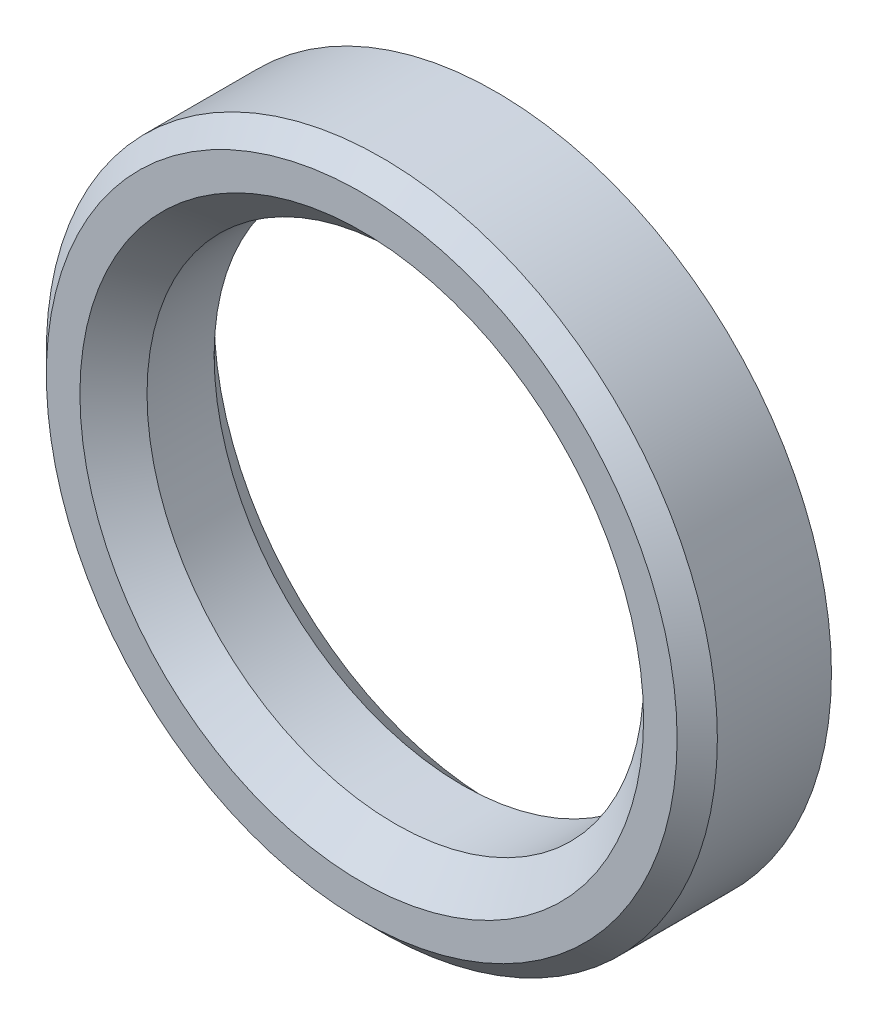
ISO-10303-21;
HEADER;
FILE_DESCRIPTION(('STEP AP214'),'2;1');
FILE_NAME('part.step','',(''),(''),'','','');
FILE_SCHEMA(('AUTOMOTIVE_DESIGN { 1 0 10303 214 1 1 1 1 }'));
ENDSEC;
DATA;
#1=APPLICATION_CONTEXT('core data for automotive mechanical design processes');
#2=APPLICATION_PROTOCOL_DEFINITION('international standard','automotive_design',2000,#1);
#3=PRODUCT_CONTEXT('',#1,'mechanical');
#4=PRODUCT('Part','Part','',(#3));
#5=PRODUCT_RELATED_PRODUCT_CATEGORY('part','',(#4));
#6=PRODUCT_DEFINITION_FORMATION('','',#4);
#7=PRODUCT_DEFINITION_CONTEXT('part definition',#1,'design');
#8=PRODUCT_DEFINITION('design','',#6,#7);
#9=PRODUCT_DEFINITION_SHAPE('','',#8);
#10=(LENGTH_UNIT() NAMED_UNIT(*) SI_UNIT(.MILLI.,.METRE.));
#11=(NAMED_UNIT(*) PLANE_ANGLE_UNIT() SI_UNIT($,.RADIAN.));
#12=(NAMED_UNIT(*) SI_UNIT($,.STERADIAN.) SOLID_ANGLE_UNIT());
#13=UNCERTAINTY_MEASURE_WITH_UNIT(LENGTH_MEASURE(1.E-05),#10,'distance_accuracy_value','');
#14=(GEOMETRIC_REPRESENTATION_CONTEXT(3) GLOBAL_UNCERTAINTY_ASSIGNED_CONTEXT((#13)) GLOBAL_UNIT_ASSIGNED_CONTEXT((#10,
#11,#12)) REPRESENTATION_CONTEXT('',''));
#15=CARTESIAN_POINT('',(0.,0.,0.));
#16=DIRECTION('',(0.,0.,1.));
#17=DIRECTION('',(1.,0.,0.));
#18=AXIS2_PLACEMENT_3D('',#15,#16,#17);
#19=CARTESIAN_POINT('',(0.,0.,2.));
#20=DIRECTION('',(0.,0.,1.));
#21=DIRECTION('',(1.,0.,0.));
#22=AXIS2_PLACEMENT_3D('',#19,#20,#21);
#23=PLANE('',#22);
#24=CARTESIAN_POINT('',(0.,0.,2.));
#25=DIRECTION('',(0.,0.,1.));
#26=DIRECTION('',(1.,0.,0.));
#27=AXIS2_PLACEMENT_3D('',#24,#25,#26);
#28=CIRCLE('',#27,4.2);
#29=CARTESIAN_POINT('',(4.2,0.,2.));
#30=VERTEX_POINT('',#29);
#31=EDGE_CURVE('E10',#30,#30,#28,.F.);
#32=ORIENTED_EDGE('',*,*,#31,.T.);
#33=EDGE_LOOP('',(#32));
#34=FACE_BOUND('',#33,.T.);
#35=CARTESIAN_POINT('',(0.,0.,2.));
#36=DIRECTION('',(0.,0.,1.));
#37=DIRECTION('',(1.,0.,0.));
#38=AXIS2_PLACEMENT_3D('',#35,#36,#37);
#39=CIRCLE('',#38,4.7);
#40=CARTESIAN_POINT('',(4.7,0.,2.));
#41=VERTEX_POINT('',#40);
#42=EDGE_CURVE('E54',#41,#41,#39,.T.);
#43=ORIENTED_EDGE('',*,*,#42,.T.);
#44=EDGE_LOOP('',(#43));
#45=FACE_BOUND('',#44,.T.);
#46=ADVANCED_FACE('F31',(#34,#45),#23,.T.);
#47=CARTESIAN_POINT('',(0.,0.,0.));
#48=DIRECTION('',(0.,0.,1.));
#49=DIRECTION('',(1.,0.,0.));
#50=AXIS2_PLACEMENT_3D('',#47,#48,#49);
#51=PLANE('',#50);
#52=CARTESIAN_POINT('',(0.,0.,0.));
#53=DIRECTION('',(0.,0.,1.));
#54=DIRECTION('',(1.,0.,0.));
#55=AXIS2_PLACEMENT_3D('',#52,#53,#54);
#56=CIRCLE('',#55,4.2);
#57=CARTESIAN_POINT('',(4.2,0.,0.));
#58=VERTEX_POINT('',#57);
#59=EDGE_CURVE('E46',#58,#58,#56,.T.);
#60=ORIENTED_EDGE('',*,*,#59,.T.);
#61=EDGE_LOOP('',(#60));
#62=FACE_BOUND('',#61,.T.);
#63=CARTESIAN_POINT('',(0.,0.,0.));
#64=DIRECTION('',(0.,0.,1.));
#65=DIRECTION('',(1.,0.,0.));
#66=AXIS2_PLACEMENT_3D('',#63,#64,#65);
#67=CIRCLE('',#66,5.);
#68=CARTESIAN_POINT('',(5.,0.,0.));
#69=VERTEX_POINT('',#68);
#70=EDGE_CURVE('E57',#69,#69,#67,.T.);
#71=ORIENTED_EDGE('',*,*,#70,.F.);
#72=EDGE_LOOP('',(#71));
#73=FACE_BOUND('',#72,.T.);
#74=ADVANCED_FACE('F63',(#62,#73),#51,.F.);
#75=CARTESIAN_POINT('',(0.,0.,2.));
#76=DIRECTION('',(0.,0.,-1.));
#77=DIRECTION('',(-1.,0.,0.));
#78=AXIS2_PLACEMENT_3D('',#75,#76,#77);
#79=CYLINDRICAL_SURFACE('',#78,5.);
#80=CARTESIAN_POINT('',(0.,0.,1.7));
#81=DIRECTION('',(0.,0.,1.));
#82=DIRECTION('',(1.,0.,0.));
#83=AXIS2_PLACEMENT_3D('',#80,#81,#82);
#84=CIRCLE('',#83,5.);
#85=CARTESIAN_POINT('',(5.,0.,1.7));
#86=VERTEX_POINT('',#85);
#87=EDGE_CURVE('E51',#86,#86,#84,.F.);
#88=ORIENTED_EDGE('',*,*,#87,.T.);
#89=EDGE_LOOP('',(#88));
#90=FACE_BOUND('',#89,.T.);
#91=ORIENTED_EDGE('',*,*,#70,.T.);
#92=EDGE_LOOP('',(#91));
#93=FACE_BOUND('',#92,.T.);
#94=ADVANCED_FACE('F61',(#90,#93),#79,.T.);
#95=CARTESIAN_POINT('',(0.,0.,2.));
#96=DIRECTION('',(0.,0.,-1.));
#97=DIRECTION('',(-1.,0.,0.));
#98=AXIS2_PLACEMENT_3D('',#95,#96,#97);
#99=CYLINDRICAL_SURFACE('',#98,3.7);
#100=CARTESIAN_POINT('',(0.,0.,0.500000000000002));
#101=DIRECTION('',(0.,0.,1.));
#102=DIRECTION('',(1.,0.,0.));
#103=AXIS2_PLACEMENT_3D('',#100,#101,#102);
#104=CIRCLE('',#103,3.7);
#105=CARTESIAN_POINT('',(3.7,0.,0.500000000000002));
#106=VERTEX_POINT('',#105);
#107=EDGE_CURVE('E38',#106,#106,#104,.F.);
#108=ORIENTED_EDGE('',*,*,#107,.T.);
#109=EDGE_LOOP('',(#108));
#110=FACE_BOUND('',#109,.T.);
#111=CARTESIAN_POINT('',(0.,0.,1.5));
#112=DIRECTION('',(0.,0.,1.));
#113=DIRECTION('',(1.,0.,0.));
#114=AXIS2_PLACEMENT_3D('',#111,#112,#113);
#115=CIRCLE('',#114,3.7);
#116=CARTESIAN_POINT('',(3.7,0.,1.5));
#117=VERTEX_POINT('',#116);
#118=EDGE_CURVE('E42',#117,#117,#115,.T.);
#119=ORIENTED_EDGE('',*,*,#118,.T.);
#120=EDGE_LOOP('',(#119));
#121=FACE_BOUND('',#120,.T.);
#122=ADVANCED_FACE('F71',(#110,#121),#99,.F.);
#123=CARTESIAN_POINT('',(0.,0.,2.));
#124=DIRECTION('',(0.,0.,-1.));
#125=DIRECTION('',(-1.,0.,0.));
#126=AXIS2_PLACEMENT_3D('',#123,#124,#125);
#127=CONICAL_SURFACE('',#126,4.7,0.785398163397448);
#128=ORIENTED_EDGE('',*,*,#87,.F.);
#129=EDGE_LOOP('',(#128));
#130=FACE_BOUND('',#129,.T.);
#131=ORIENTED_EDGE('',*,*,#42,.F.);
#132=EDGE_LOOP('',(#131));
#133=FACE_BOUND('',#132,.T.);
#134=ADVANCED_FACE('F77',(#130,#133),#127,.T.);
#135=CARTESIAN_POINT('',(0.,0.,0.));
#136=DIRECTION('',(0.,0.,-1.));
#137=DIRECTION('',(-1.,0.,0.));
#138=AXIS2_PLACEMENT_3D('',#135,#136,#137);
#139=CONICAL_SURFACE('',#138,4.2,0.785398163397446);
#140=ORIENTED_EDGE('',*,*,#107,.F.);
#141=EDGE_LOOP('',(#140));
#142=FACE_BOUND('',#141,.T.);
#143=ORIENTED_EDGE('',*,*,#59,.F.);
#144=EDGE_LOOP('',(#143));
#145=FACE_BOUND('',#144,.T.);
#146=ADVANCED_FACE('F79',(#142,#145),#139,.F.);
#147=CARTESIAN_POINT('',(0.,0.,1.5));
#148=DIRECTION('',(0.,0.,1.));
#149=DIRECTION('',(1.,0.,0.));
#150=AXIS2_PLACEMENT_3D('',#147,#148,#149);
#151=CONICAL_SURFACE('',#150,3.7,0.785398163397451);
#152=ORIENTED_EDGE('',*,*,#31,.F.);
#153=EDGE_LOOP('',(#152));
#154=FACE_BOUND('',#153,.T.);
#155=ORIENTED_EDGE('',*,*,#118,.F.);
#156=EDGE_LOOP('',(#155));
#157=FACE_BOUND('',#156,.T.);
#158=ADVANCED_FACE('F33',(#154,#157),#151,.F.);
#159=CLOSED_SHELL('',(#46,#74,#94,#122,#134,#146,#158));
#160=MANIFOLD_SOLID_BREP('B2',#159);
#161=ADVANCED_BREP_SHAPE_REPRESENTATION('',(#18,#160),#14);
#162=SHAPE_DEFINITION_REPRESENTATION(#9,#161);
ENDSEC;
END-ISO-10303-21;
